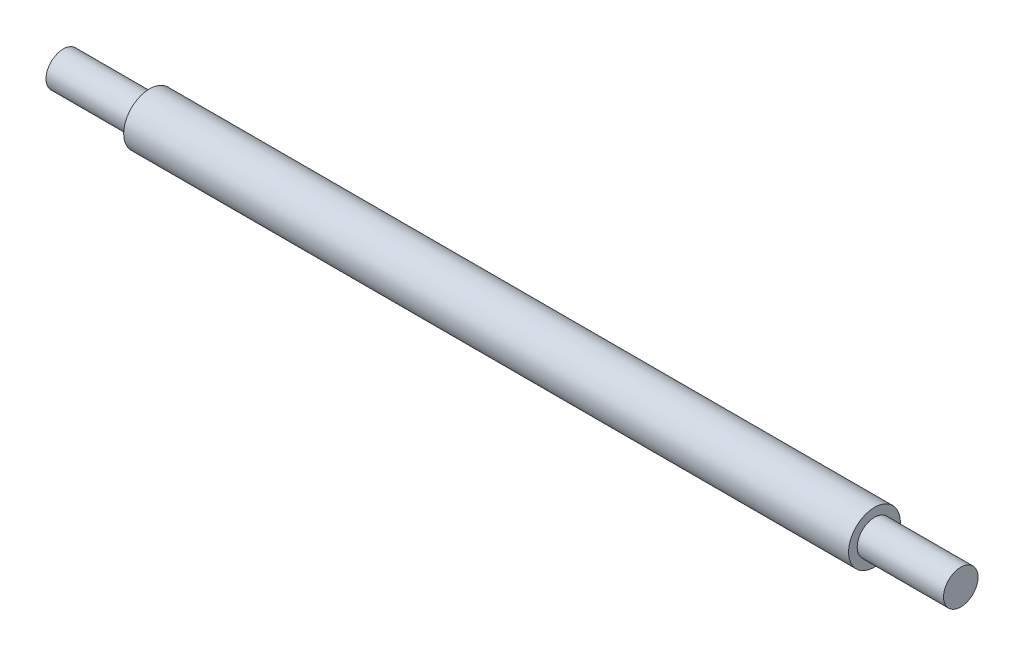
ISO-10303-21;
HEADER;
FILE_DESCRIPTION(('STEP AP214'),'2;1');
FILE_NAME('part.step','',(''),(''),'','','');
FILE_SCHEMA(('AUTOMOTIVE_DESIGN { 1 0 10303 214 1 1 1 1 }'));
ENDSEC;
DATA;
#1=APPLICATION_CONTEXT('core data for automotive mechanical design processes');
#2=APPLICATION_PROTOCOL_DEFINITION('international standard','automotive_design',2000,#1);
#3=PRODUCT_CONTEXT('',#1,'mechanical');
#4=PRODUCT('Part','Part','',(#3));
#5=PRODUCT_RELATED_PRODUCT_CATEGORY('part','',(#4));
#6=PRODUCT_DEFINITION_FORMATION('','',#4);
#7=PRODUCT_DEFINITION_CONTEXT('part definition',#1,'design');
#8=PRODUCT_DEFINITION('design','',#6,#7);
#9=PRODUCT_DEFINITION_SHAPE('','',#8);
#10=(LENGTH_UNIT() NAMED_UNIT(*) SI_UNIT(.MILLI.,.METRE.));
#11=(NAMED_UNIT(*) PLANE_ANGLE_UNIT() SI_UNIT($,.RADIAN.));
#12=(NAMED_UNIT(*) SI_UNIT($,.STERADIAN.) SOLID_ANGLE_UNIT());
#13=UNCERTAINTY_MEASURE_WITH_UNIT(LENGTH_MEASURE(1.E-05),#10,'distance_accuracy_value','');
#14=(GEOMETRIC_REPRESENTATION_CONTEXT(3) GLOBAL_UNCERTAINTY_ASSIGNED_CONTEXT((#13)) GLOBAL_UNIT_ASSIGNED_CONTEXT((#10,
#11,#12)) REPRESENTATION_CONTEXT('',''));
#15=CARTESIAN_POINT('',(0.,0.,0.));
#16=DIRECTION('',(0.,0.,1.));
#17=DIRECTION('',(1.,0.,0.));
#18=AXIS2_PLACEMENT_3D('',#15,#16,#17);
#19=CARTESIAN_POINT('',(52.,0.,0.));
#20=DIRECTION('',(-1.,0.,0.));
#21=DIRECTION('',(0.,0.,1.));
#22=AXIS2_PLACEMENT_3D('',#19,#20,#21);
#23=PLANE('',#22);
#24=CARTESIAN_POINT('',(52.,0.,0.));
#25=DIRECTION('',(-1.,0.,0.));
#26=DIRECTION('',(0.,0.,1.));
#27=AXIS2_PLACEMENT_3D('',#24,#25,#26);
#28=CIRCLE('',#27,2.00000000000003);
#29=CARTESIAN_POINT('',(52.,0.,2.00000000000003));
#30=VERTEX_POINT('',#29);
#31=EDGE_CURVE('E10',#30,#30,#28,.T.);
#32=ORIENTED_EDGE('',*,*,#31,.F.);
#33=EDGE_LOOP('',(#32));
#34=FACE_BOUND('',#33,.T.);
#35=ADVANCED_FACE('F35',(#34),#23,.F.);
#36=CARTESIAN_POINT('',(0.,0.,0.));
#37=DIRECTION('',(-1.,0.,0.));
#38=DIRECTION('',(0.,0.,1.));
#39=AXIS2_PLACEMENT_3D('',#36,#37,#38);
#40=CYLINDRICAL_SURFACE('',#39,2.00000000000001);
#41=CARTESIAN_POINT('',(42.,0.,0.));
#42=DIRECTION('',(-1.,0.,0.));
#43=DIRECTION('',(0.,0.,1.));
#44=AXIS2_PLACEMENT_3D('',#41,#42,#43);
#45=CIRCLE('',#44,1.99999999999999);
#46=CARTESIAN_POINT('',(42.,0.,1.99999999999999));
#47=VERTEX_POINT('',#46);
#48=EDGE_CURVE('E41',#47,#47,#45,.T.);
#49=ORIENTED_EDGE('',*,*,#48,.F.);
#50=EDGE_LOOP('',(#49));
#51=FACE_BOUND('',#50,.T.);
#52=ORIENTED_EDGE('',*,*,#31,.T.);
#53=EDGE_LOOP('',(#52));
#54=FACE_BOUND('',#53,.T.);
#55=ADVANCED_FACE('F83',(#51,#54),#40,.T.);
#56=CARTESIAN_POINT('',(42.,0.,-1.99999999999999));
#57=DIRECTION('',(-1.,0.,0.));
#58=DIRECTION('',(0.,0.,1.));
#59=AXIS2_PLACEMENT_3D('',#56,#57,#58);
#60=PLANE('',#59);
#61=CARTESIAN_POINT('',(42.,0.,0.));
#62=DIRECTION('',(-1.,0.,0.));
#63=DIRECTION('',(0.,0.,1.));
#64=AXIS2_PLACEMENT_3D('',#61,#62,#63);
#65=CIRCLE('',#64,2.99999999999999);
#66=CARTESIAN_POINT('',(42.,0.,2.99999999999999));
#67=VERTEX_POINT('',#66);
#68=EDGE_CURVE('E45',#67,#67,#65,.T.);
#69=ORIENTED_EDGE('',*,*,#68,.F.);
#70=EDGE_LOOP('',(#69));
#71=FACE_BOUND('',#70,.T.);
#72=ORIENTED_EDGE('',*,*,#48,.T.);
#73=EDGE_LOOP('',(#72));
#74=FACE_BOUND('',#73,.T.);
#75=ADVANCED_FACE('F78',(#71,#74),#60,.F.);
#76=CARTESIAN_POINT('',(0.,0.,0.));
#77=DIRECTION('',(-1.,0.,0.));
#78=DIRECTION('',(0.,0.,1.));
#79=AXIS2_PLACEMENT_3D('',#76,#77,#78);
#80=CYLINDRICAL_SURFACE('',#79,2.99999999999999);
#81=CARTESIAN_POINT('',(-42.,0.,0.));
#82=DIRECTION('',(-1.,0.,0.));
#83=DIRECTION('',(0.,0.,1.));
#84=AXIS2_PLACEMENT_3D('',#81,#82,#83);
#85=CIRCLE('',#84,2.99999999999999);
#86=CARTESIAN_POINT('',(-42.,0.,2.99999999999999));
#87=VERTEX_POINT('',#86);
#88=EDGE_CURVE('E49',#87,#87,#85,.T.);
#89=ORIENTED_EDGE('',*,*,#88,.F.);
#90=EDGE_LOOP('',(#89));
#91=FACE_BOUND('',#90,.T.);
#92=ORIENTED_EDGE('',*,*,#68,.T.);
#93=EDGE_LOOP('',(#92));
#94=FACE_BOUND('',#93,.T.);
#95=ADVANCED_FACE('F72',(#91,#94),#80,.T.);
#96=CARTESIAN_POINT('',(-42.,0.,-2.99999999999999));
#97=DIRECTION('',(1.,0.,0.));
#98=DIRECTION('',(0.,0.,-1.));
#99=AXIS2_PLACEMENT_3D('',#96,#97,#98);
#100=PLANE('',#99);
#101=CARTESIAN_POINT('',(-42.,0.,0.));
#102=DIRECTION('',(-1.,0.,0.));
#103=DIRECTION('',(0.,0.,1.));
#104=AXIS2_PLACEMENT_3D('',#101,#102,#103);
#105=CIRCLE('',#104,1.99999999999999);
#106=CARTESIAN_POINT('',(-42.,0.,1.99999999999999));
#107=VERTEX_POINT('',#106);
#108=EDGE_CURVE('E54',#107,#107,#105,.T.);
#109=ORIENTED_EDGE('',*,*,#108,.F.);
#110=EDGE_LOOP('',(#109));
#111=FACE_BOUND('',#110,.T.);
#112=ORIENTED_EDGE('',*,*,#88,.T.);
#113=EDGE_LOOP('',(#112));
#114=FACE_BOUND('',#113,.T.);
#115=ADVANCED_FACE('F66',(#111,#114),#100,.F.);
#116=CARTESIAN_POINT('',(0.,0.,0.));
#117=DIRECTION('',(-1.,0.,0.));
#118=DIRECTION('',(0.,0.,1.));
#119=AXIS2_PLACEMENT_3D('',#116,#117,#118);
#120=CYLINDRICAL_SURFACE('',#119,1.99999999999997);
#121=CARTESIAN_POINT('',(-52.,0.,0.));
#122=DIRECTION('',(-1.,0.,0.));
#123=DIRECTION('',(0.,0.,1.));
#124=AXIS2_PLACEMENT_3D('',#121,#122,#123);
#125=CIRCLE('',#124,1.99999999999995);
#126=CARTESIAN_POINT('',(-52.,0.,1.99999999999995));
#127=VERTEX_POINT('',#126);
#128=EDGE_CURVE('E57',#127,#127,#125,.T.);
#129=ORIENTED_EDGE('',*,*,#128,.F.);
#130=EDGE_LOOP('',(#129));
#131=FACE_BOUND('',#130,.T.);
#132=ORIENTED_EDGE('',*,*,#108,.T.);
#133=EDGE_LOOP('',(#132));
#134=FACE_BOUND('',#133,.T.);
#135=ADVANCED_FACE('F63',(#131,#134),#120,.T.);
#136=CARTESIAN_POINT('',(-52.,0.,-1.99999999999995));
#137=DIRECTION('',(1.,0.,0.));
#138=DIRECTION('',(0.,0.,-1.));
#139=AXIS2_PLACEMENT_3D('',#136,#137,#138);
#140=PLANE('',#139);
#141=ORIENTED_EDGE('',*,*,#128,.T.);
#142=EDGE_LOOP('',(#141));
#143=FACE_BOUND('',#142,.T.);
#144=ADVANCED_FACE('F61',(#143),#140,.F.);
#145=CLOSED_SHELL('',(#35,#55,#75,#95,#115,#135,#144));
#146=MANIFOLD_SOLID_BREP('B2',#145);
#147=ADVANCED_BREP_SHAPE_REPRESENTATION('',(#18,#146),#14);
#148=SHAPE_DEFINITION_REPRESENTATION(#9,#147);
ENDSEC;
END-ISO-10303-21;
